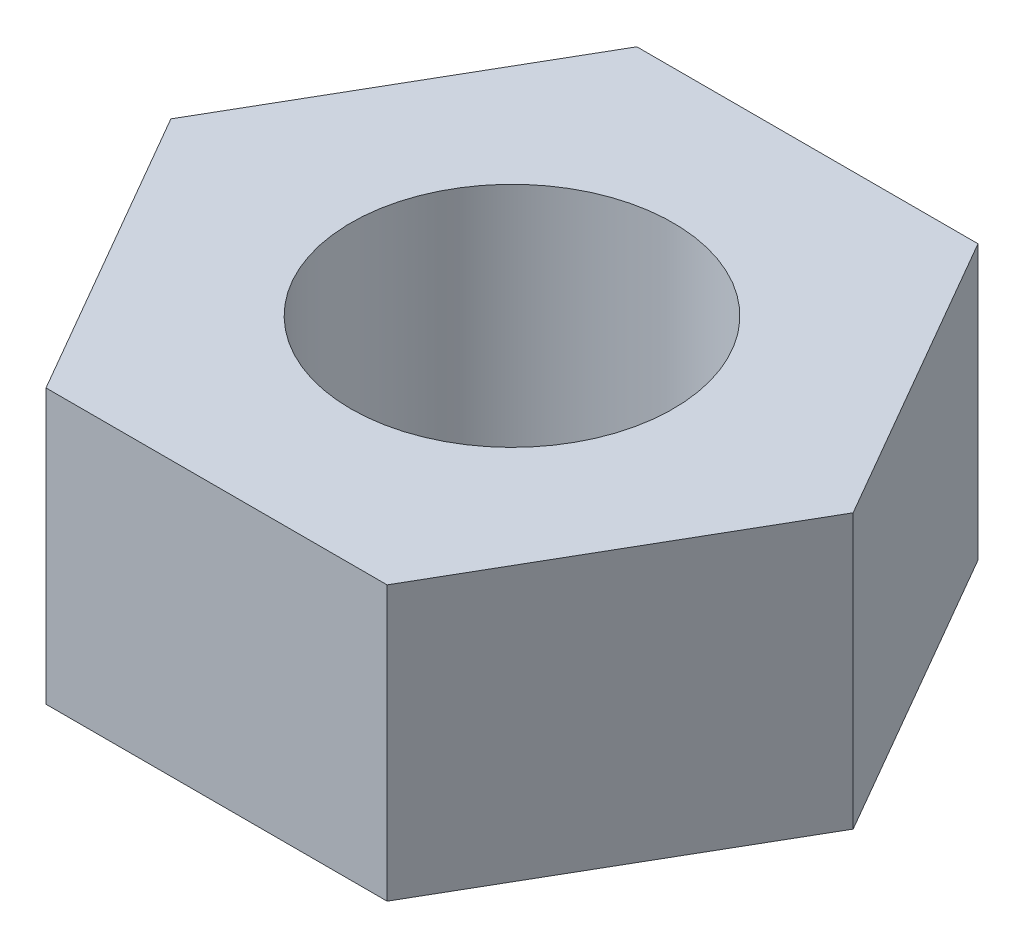
ISO-10303-21;
HEADER;
FILE_DESCRIPTION(('STEP AP214'),'2;1');
FILE_NAME('part.step','',(''),(''),'','','');
FILE_SCHEMA(('AUTOMOTIVE_DESIGN { 1 0 10303 214 1 1 1 1 }'));
ENDSEC;
DATA;
#1=APPLICATION_CONTEXT('core data for automotive mechanical design processes');
#2=APPLICATION_PROTOCOL_DEFINITION('international standard','automotive_design',2000,#1);
#3=PRODUCT_CONTEXT('',#1,'mechanical');
#4=PRODUCT('Part','Part','',(#3));
#5=PRODUCT_RELATED_PRODUCT_CATEGORY('part','',(#4));
#6=PRODUCT_DEFINITION_FORMATION('','',#4);
#7=PRODUCT_DEFINITION_CONTEXT('part definition',#1,'design');
#8=PRODUCT_DEFINITION('design','',#6,#7);
#9=PRODUCT_DEFINITION_SHAPE('','',#8);
#10=(LENGTH_UNIT() NAMED_UNIT(*) SI_UNIT(.MILLI.,.METRE.));
#11=(NAMED_UNIT(*) PLANE_ANGLE_UNIT() SI_UNIT($,.RADIAN.));
#12=(NAMED_UNIT(*) SI_UNIT($,.STERADIAN.) SOLID_ANGLE_UNIT());
#13=UNCERTAINTY_MEASURE_WITH_UNIT(LENGTH_MEASURE(1.E-05),#10,'distance_accuracy_value','');
#14=(GEOMETRIC_REPRESENTATION_CONTEXT(3) GLOBAL_UNCERTAINTY_ASSIGNED_CONTEXT((#13)) GLOBAL_UNIT_ASSIGNED_CONTEXT((#10,
#11,#12)) REPRESENTATION_CONTEXT('',''));
#15=CARTESIAN_POINT('',(0.,0.,0.));
#16=DIRECTION('',(0.,0.,1.));
#17=DIRECTION('',(1.,0.,0.));
#18=AXIS2_PLACEMENT_3D('',#15,#16,#17);
#19=CARTESIAN_POINT('',(0.,2.55,0.));
#20=DIRECTION('',(0.,1.,0.));
#21=DIRECTION('',(0.,0.,1.));
#22=AXIS2_PLACEMENT_3D('',#19,#20,#21);
#23=PLANE('',#22);
#24=DIRECTION('',(0.499999999999995,0.,-0.866025403784442));
#25=VECTOR('',#24,1.);
#26=CARTESIAN_POINT('',(1.5877132402715,2.55,2.74999999999998));
#27=LINE('',#26,#25);
#28=CARTESIAN_POINT('',(1.5877132402715,2.55,2.74999999999998));
#29=VERTEX_POINT('',#28);
#30=CARTESIAN_POINT('',(3.17542648054294,2.55,0.));
#31=VERTEX_POINT('',#30);
#32=EDGE_CURVE('E132',#29,#31,#27,.T.);
#33=ORIENTED_EDGE('',*,*,#32,.T.);
#34=DIRECTION('',(-0.500000000000001,0.,-0.866025403784438));
#35=VECTOR('',#34,1.);
#36=CARTESIAN_POINT('',(3.17542648054294,2.55,0.));
#37=LINE('',#36,#35);
#38=CARTESIAN_POINT('',(1.58771324027147,2.55,-2.75000000000001));
#39=VERTEX_POINT('',#38);
#40=EDGE_CURVE('E90',#31,#39,#37,.T.);
#41=ORIENTED_EDGE('',*,*,#40,.T.);
#42=DIRECTION('',(-1.,0.,0.));
#43=VECTOR('',#42,1.);
#44=CARTESIAN_POINT('',(1.58771324027147,2.55,-2.75000000000001));
#45=LINE('',#44,#43);
#46=CARTESIAN_POINT('',(-1.58771324027148,2.55,-2.74999999999999));
#47=VERTEX_POINT('',#46);
#48=EDGE_CURVE('E103',#39,#47,#45,.T.);
#49=ORIENTED_EDGE('',*,*,#48,.T.);
#50=DIRECTION('',(-0.499999999999995,0.,0.866025403784441));
#51=VECTOR('',#50,1.);
#52=CARTESIAN_POINT('',(-1.58771324027148,2.55,-2.74999999999999));
#53=LINE('',#52,#51);
#54=CARTESIAN_POINT('',(-3.17542648054294,2.55,0.));
#55=VERTEX_POINT('',#54);
#56=EDGE_CURVE('E97',#47,#55,#53,.T.);
#57=ORIENTED_EDGE('',*,*,#56,.T.);
#58=DIRECTION('',(0.500000000000007,0.,0.866025403784435));
#59=VECTOR('',#58,1.);
#60=CARTESIAN_POINT('',(-3.17542648054294,2.55,0.));
#61=LINE('',#60,#59);
#62=CARTESIAN_POINT('',(-1.58771324027145,2.55,2.75000000000002));
#63=VERTEX_POINT('',#62);
#64=EDGE_CURVE('E101',#55,#63,#61,.T.);
#65=ORIENTED_EDGE('',*,*,#64,.T.);
#66=DIRECTION('',(1.,0.,0.));
#67=VECTOR('',#66,1.);
#68=CARTESIAN_POINT('',(-1.58771324027145,2.55,2.75000000000002));
#69=LINE('',#68,#67);
#70=EDGE_CURVE('E53',#63,#29,#69,.T.);
#71=ORIENTED_EDGE('',*,*,#70,.T.);
#72=EDGE_LOOP('',(#33,#41,#49,#57,#65,#71));
#73=FACE_BOUND('',#72,.T.);
#74=CARTESIAN_POINT('',(0.,2.55,0.));
#75=DIRECTION('',(0.,1.,0.));
#76=DIRECTION('',(0.,0.,1.));
#77=AXIS2_PLACEMENT_3D('',#74,#75,#76);
#78=CIRCLE('',#77,1.5);
#79=CARTESIAN_POINT('',(0.,2.55,1.5));
#80=VERTEX_POINT('',#79);
#81=EDGE_CURVE('E125',#80,#80,#78,.T.);
#82=ORIENTED_EDGE('',*,*,#81,.F.);
#83=EDGE_LOOP('',(#82));
#84=FACE_BOUND('',#83,.T.);
#85=ADVANCED_FACE('F36',(#73,#84),#23,.T.);
#86=CARTESIAN_POINT('',(0.,0.,0.));
#87=DIRECTION('',(0.,1.,0.));
#88=DIRECTION('',(0.,0.,1.));
#89=AXIS2_PLACEMENT_3D('',#86,#87,#88);
#90=PLANE('',#89);
#91=DIRECTION('',(0.499999999999995,0.,-0.866025403784442));
#92=VECTOR('',#91,1.);
#93=CARTESIAN_POINT('',(1.5877132402715,0.,2.74999999999998));
#94=LINE('',#93,#92);
#95=CARTESIAN_POINT('',(1.5877132402715,0.,2.74999999999998));
#96=VERTEX_POINT('',#95);
#97=CARTESIAN_POINT('',(3.17542648054294,0.,0.));
#98=VERTEX_POINT('',#97);
#99=EDGE_CURVE('E121',#96,#98,#94,.T.);
#100=ORIENTED_EDGE('',*,*,#99,.F.);
#101=DIRECTION('',(1.,0.,0.));
#102=VECTOR('',#101,1.);
#103=CARTESIAN_POINT('',(-1.58771324027145,0.,2.75000000000002));
#104=LINE('',#103,#102);
#105=CARTESIAN_POINT('',(-1.58771324027145,0.,2.75000000000002));
#106=VERTEX_POINT('',#105);
#107=EDGE_CURVE('E82',#106,#96,#104,.T.);
#108=ORIENTED_EDGE('',*,*,#107,.F.);
#109=DIRECTION('',(0.500000000000007,0.,0.866025403784435));
#110=VECTOR('',#109,1.);
#111=CARTESIAN_POINT('',(-3.17542648054294,0.,0.));
#112=LINE('',#111,#110);
#113=CARTESIAN_POINT('',(-3.17542648054294,0.,0.));
#114=VERTEX_POINT('',#113);
#115=EDGE_CURVE('E76',#114,#106,#112,.T.);
#116=ORIENTED_EDGE('',*,*,#115,.F.);
#117=DIRECTION('',(-0.499999999999995,0.,0.866025403784441));
#118=VECTOR('',#117,1.);
#119=CARTESIAN_POINT('',(-1.58771324027148,0.,-2.74999999999999));
#120=LINE('',#119,#118);
#121=CARTESIAN_POINT('',(-1.58771324027148,0.,-2.74999999999999));
#122=VERTEX_POINT('',#121);
#123=EDGE_CURVE('E111',#122,#114,#120,.T.);
#124=ORIENTED_EDGE('',*,*,#123,.F.);
#125=DIRECTION('',(-1.,0.,0.));
#126=VECTOR('',#125,1.);
#127=CARTESIAN_POINT('',(1.58771324027147,0.,-2.75000000000001));
#128=LINE('',#127,#126);
#129=CARTESIAN_POINT('',(1.58771324027147,0.,-2.75000000000001));
#130=VERTEX_POINT('',#129);
#131=EDGE_CURVE('E127',#130,#122,#128,.T.);
#132=ORIENTED_EDGE('',*,*,#131,.F.);
#133=DIRECTION('',(-0.500000000000001,0.,-0.866025403784438));
#134=VECTOR('',#133,1.);
#135=CARTESIAN_POINT('',(3.17542648054294,0.,0.));
#136=LINE('',#135,#134);
#137=EDGE_CURVE('E124',#98,#130,#136,.T.);
#138=ORIENTED_EDGE('',*,*,#137,.F.);
#139=EDGE_LOOP('',(#100,#108,#116,#124,#132,#138));
#140=FACE_BOUND('',#139,.T.);
#141=CARTESIAN_POINT('',(0.,0.,0.));
#142=DIRECTION('',(0.,1.,0.));
#143=DIRECTION('',(0.,0.,1.));
#144=AXIS2_PLACEMENT_3D('',#141,#142,#143);
#145=CIRCLE('',#144,1.5);
#146=CARTESIAN_POINT('',(0.,0.,1.5));
#147=VERTEX_POINT('',#146);
#148=EDGE_CURVE('E225',#147,#147,#145,.T.);
#149=ORIENTED_EDGE('',*,*,#148,.T.);
#150=EDGE_LOOP('',(#149));
#151=FACE_BOUND('',#150,.T.);
#152=ADVANCED_FACE('F141',(#140,#151),#90,.F.);
#153=CARTESIAN_POINT('',(1.5877132402715,2.55,2.74999999999998));
#154=DIRECTION('',(-0.866025403784441,0.,-0.499999999999995));
#155=DIRECTION('',(-0.499999999999995,0.,0.866025403784442));
#156=AXIS2_PLACEMENT_3D('',#153,#154,#155);
#157=PLANE('',#156);
#158=ORIENTED_EDGE('',*,*,#99,.T.);
#159=DIRECTION('',(0.,-1.,0.));
#160=VECTOR('',#159,1.);
#161=CARTESIAN_POINT('',(3.17542648054294,2.55,0.));
#162=LINE('',#161,#160);
#163=EDGE_CURVE('E11',#31,#98,#162,.T.);
#164=ORIENTED_EDGE('',*,*,#163,.F.);
#165=ORIENTED_EDGE('',*,*,#32,.F.);
#166=DIRECTION('',(0.,-1.,0.));
#167=VECTOR('',#166,1.);
#168=CARTESIAN_POINT('',(1.5877132402715,2.55,2.74999999999998));
#169=LINE('',#168,#167);
#170=EDGE_CURVE('E117',#29,#96,#169,.T.);
#171=ORIENTED_EDGE('',*,*,#170,.T.);
#172=EDGE_LOOP('',(#158,#164,#165,#171));
#173=FACE_BOUND('',#172,.T.);
#174=ADVANCED_FACE('F38',(#173),#157,.F.);
#175=CARTESIAN_POINT('',(3.17542648054294,2.55,0.));
#176=DIRECTION('',(-0.866025403784438,0.,0.500000000000001));
#177=DIRECTION('',(0.500000000000001,0.,0.866025403784438));
#178=AXIS2_PLACEMENT_3D('',#175,#176,#177);
#179=PLANE('',#178);
#180=ORIENTED_EDGE('',*,*,#137,.T.);
#181=DIRECTION('',(0.,-1.,0.));
#182=VECTOR('',#181,1.);
#183=CARTESIAN_POINT('',(1.58771324027147,2.55,-2.75000000000001));
#184=LINE('',#183,#182);
#185=EDGE_CURVE('E45',#39,#130,#184,.T.);
#186=ORIENTED_EDGE('',*,*,#185,.F.);
#187=ORIENTED_EDGE('',*,*,#40,.F.);
#188=ORIENTED_EDGE('',*,*,#163,.T.);
#189=EDGE_LOOP('',(#180,#186,#187,#188));
#190=FACE_BOUND('',#189,.T.);
#191=ADVANCED_FACE('F166',(#190),#179,.F.);
#192=CARTESIAN_POINT('',(1.58771324027147,2.55,-2.75000000000001));
#193=DIRECTION('',(0.,0.,1.));
#194=DIRECTION('',(1.,0.,0.));
#195=AXIS2_PLACEMENT_3D('',#192,#193,#194);
#196=PLANE('',#195);
#197=ORIENTED_EDGE('',*,*,#131,.T.);
#198=DIRECTION('',(0.,-1.,0.));
#199=VECTOR('',#198,1.);
#200=CARTESIAN_POINT('',(-1.58771324027148,2.55,-2.74999999999999));
#201=LINE('',#200,#199);
#202=EDGE_CURVE('E112',#47,#122,#201,.T.);
#203=ORIENTED_EDGE('',*,*,#202,.F.);
#204=ORIENTED_EDGE('',*,*,#48,.F.);
#205=ORIENTED_EDGE('',*,*,#185,.T.);
#206=EDGE_LOOP('',(#197,#203,#204,#205));
#207=FACE_BOUND('',#206,.T.);
#208=ADVANCED_FACE('F138',(#207),#196,.F.);
#209=CARTESIAN_POINT('',(-1.58771324027148,2.55,-2.74999999999999));
#210=DIRECTION('',(0.866025403784441,0.,0.499999999999995));
#211=DIRECTION('',(0.499999999999995,0.,-0.866025403784441));
#212=AXIS2_PLACEMENT_3D('',#209,#210,#211);
#213=PLANE('',#212);
#214=ORIENTED_EDGE('',*,*,#123,.T.);
#215=DIRECTION('',(0.,-1.,0.));
#216=VECTOR('',#215,1.);
#217=CARTESIAN_POINT('',(-3.17542648054294,2.55,0.));
#218=LINE('',#217,#216);
#219=EDGE_CURVE('E108',#55,#114,#218,.T.);
#220=ORIENTED_EDGE('',*,*,#219,.F.);
#221=ORIENTED_EDGE('',*,*,#56,.F.);
#222=ORIENTED_EDGE('',*,*,#202,.T.);
#223=EDGE_LOOP('',(#214,#220,#221,#222));
#224=FACE_BOUND('',#223,.T.);
#225=ADVANCED_FACE('F109',(#224),#213,.F.);
#226=CARTESIAN_POINT('',(-3.17542648054294,2.55,0.));
#227=DIRECTION('',(0.866025403784434,0.,-0.500000000000007));
#228=DIRECTION('',(-0.500000000000007,0.,-0.866025403784435));
#229=AXIS2_PLACEMENT_3D('',#226,#227,#228);
#230=PLANE('',#229);
#231=ORIENTED_EDGE('',*,*,#115,.T.);
#232=DIRECTION('',(0.,-1.,0.));
#233=VECTOR('',#232,1.);
#234=CARTESIAN_POINT('',(-1.58771324027145,2.55,2.75000000000002));
#235=LINE('',#234,#233);
#236=EDGE_CURVE('E113',#63,#106,#235,.T.);
#237=ORIENTED_EDGE('',*,*,#236,.F.);
#238=ORIENTED_EDGE('',*,*,#64,.F.);
#239=ORIENTED_EDGE('',*,*,#219,.T.);
#240=EDGE_LOOP('',(#231,#237,#238,#239));
#241=FACE_BOUND('',#240,.T.);
#242=ADVANCED_FACE('F115',(#241),#230,.F.);
#243=CARTESIAN_POINT('',(-1.58771324027145,2.55,2.75000000000002));
#244=DIRECTION('',(0.,0.,-1.));
#245=DIRECTION('',(-1.,0.,0.));
#246=AXIS2_PLACEMENT_3D('',#243,#244,#245);
#247=PLANE('',#246);
#248=ORIENTED_EDGE('',*,*,#107,.T.);
#249=ORIENTED_EDGE('',*,*,#170,.F.);
#250=ORIENTED_EDGE('',*,*,#70,.F.);
#251=ORIENTED_EDGE('',*,*,#236,.T.);
#252=EDGE_LOOP('',(#248,#249,#250,#251));
#253=FACE_BOUND('',#252,.T.);
#254=ADVANCED_FACE('F146',(#253),#247,.F.);
#255=CARTESIAN_POINT('',(0.,2.55,0.));
#256=DIRECTION('',(0.,-1.,0.));
#257=DIRECTION('',(0.,0.,-1.));
#258=AXIS2_PLACEMENT_3D('',#255,#256,#257);
#259=CYLINDRICAL_SURFACE('',#258,1.5);
#260=ORIENTED_EDGE('',*,*,#81,.T.);
#261=EDGE_LOOP('',(#260));
#262=FACE_BOUND('',#261,.T.);
#263=ORIENTED_EDGE('',*,*,#148,.F.);
#264=EDGE_LOOP('',(#263));
#265=FACE_BOUND('',#264,.T.);
#266=ADVANCED_FACE('F148',(#262,#265),#259,.F.);
#267=CLOSED_SHELL('',(#85,#152,#174,#191,#208,#225,#242,#254,#266));
#268=MANIFOLD_SOLID_BREP('B2',#267);
#269=ADVANCED_BREP_SHAPE_REPRESENTATION('',(#18,#268),#14);
#270=SHAPE_DEFINITION_REPRESENTATION(#9,#269);
ENDSEC;
END-ISO-10303-21;
